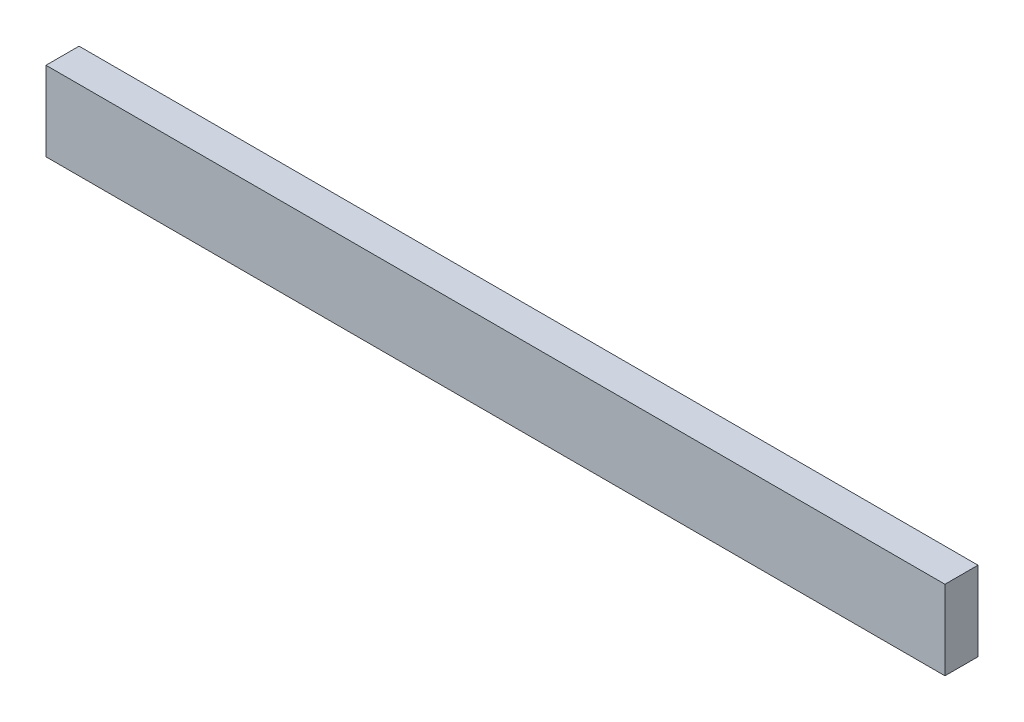
ISO-10303-21;
HEADER;
FILE_DESCRIPTION(('STEP AP214'),'2;1');
FILE_NAME('part.step','',(''),(''),'','','');
FILE_SCHEMA(('AUTOMOTIVE_DESIGN { 1 0 10303 214 1 1 1 1 }'));
ENDSEC;
DATA;
#1=APPLICATION_CONTEXT('core data for automotive mechanical design processes');
#2=APPLICATION_PROTOCOL_DEFINITION('international standard','automotive_design',2000,#1);
#3=PRODUCT_CONTEXT('',#1,'mechanical');
#4=PRODUCT('Part','Part','',(#3));
#5=PRODUCT_RELATED_PRODUCT_CATEGORY('part','',(#4));
#6=PRODUCT_DEFINITION_FORMATION('','',#4);
#7=PRODUCT_DEFINITION_CONTEXT('part definition',#1,'design');
#8=PRODUCT_DEFINITION('design','',#6,#7);
#9=PRODUCT_DEFINITION_SHAPE('','',#8);
#10=(LENGTH_UNIT() NAMED_UNIT(*) SI_UNIT(.MILLI.,.METRE.));
#11=(NAMED_UNIT(*) PLANE_ANGLE_UNIT() SI_UNIT($,.RADIAN.));
#12=(NAMED_UNIT(*) SI_UNIT($,.STERADIAN.) SOLID_ANGLE_UNIT());
#13=UNCERTAINTY_MEASURE_WITH_UNIT(LENGTH_MEASURE(1.E-05),#10,'distance_accuracy_value','');
#14=(GEOMETRIC_REPRESENTATION_CONTEXT(3) GLOBAL_UNCERTAINTY_ASSIGNED_CONTEXT((#13)) GLOBAL_UNIT_ASSIGNED_CONTEXT((#10,
#11,#12)) REPRESENTATION_CONTEXT('',''));
#15=CARTESIAN_POINT('',(0.,0.,0.));
#16=DIRECTION('',(0.,0.,1.));
#17=DIRECTION('',(1.,0.,0.));
#18=AXIS2_PLACEMENT_3D('',#15,#16,#17);
#19=CARTESIAN_POINT('',(0.,0.,25.));
#20=DIRECTION('',(1.,0.,0.));
#21=DIRECTION('',(0.,0.,-1.));
#22=AXIS2_PLACEMENT_3D('',#19,#20,#21);
#23=PLANE('',#22);
#24=DIRECTION('',(0.,-1.,0.));
#25=VECTOR('',#24,1.);
#26=CARTESIAN_POINT('',(0.,0.,0.));
#27=LINE('',#26,#25);
#28=CARTESIAN_POINT('',(0.,60.,0.));
#29=VERTEX_POINT('',#28);
#30=CARTESIAN_POINT('',(0.,0.,0.));
#31=VERTEX_POINT('',#30);
#32=EDGE_CURVE('E96',#29,#31,#27,.T.);
#33=ORIENTED_EDGE('',*,*,#32,.T.);
#34=DIRECTION('',(0.,0.,-1.));
#35=VECTOR('',#34,1.);
#36=CARTESIAN_POINT('',(0.,0.,25.));
#37=LINE('',#36,#35);
#38=CARTESIAN_POINT('',(0.,0.,25.));
#39=VERTEX_POINT('',#38);
#40=EDGE_CURVE('E11',#39,#31,#37,.T.);
#41=ORIENTED_EDGE('',*,*,#40,.F.);
#42=DIRECTION('',(0.,-1.,0.));
#43=VECTOR('',#42,1.);
#44=CARTESIAN_POINT('',(0.,0.,25.));
#45=LINE('',#44,#43);
#46=CARTESIAN_POINT('',(0.,60.,25.));
#47=VERTEX_POINT('',#46);
#48=EDGE_CURVE('E84',#47,#39,#45,.T.);
#49=ORIENTED_EDGE('',*,*,#48,.F.);
#50=DIRECTION('',(0.,0.,-1.));
#51=VECTOR('',#50,1.);
#52=CARTESIAN_POINT('',(0.,60.,25.));
#53=LINE('',#52,#51);
#54=EDGE_CURVE('E92',#47,#29,#53,.T.);
#55=ORIENTED_EDGE('',*,*,#54,.T.);
#56=EDGE_LOOP('',(#33,#41,#49,#55));
#57=FACE_BOUND('',#56,.T.);
#58=ADVANCED_FACE('F33',(#57),#23,.F.);
#59=CARTESIAN_POINT('',(0.,0.,25.));
#60=DIRECTION('',(0.,1.,0.));
#61=DIRECTION('',(0.,0.,1.));
#62=AXIS2_PLACEMENT_3D('',#59,#60,#61);
#63=PLANE('',#62);
#64=DIRECTION('',(1.,0.,0.));
#65=VECTOR('',#64,1.);
#66=CARTESIAN_POINT('',(0.,0.,0.));
#67=LINE('',#66,#65);
#68=CARTESIAN_POINT('',(680.,0.,0.));
#69=VERTEX_POINT('',#68);
#70=EDGE_CURVE('E88',#31,#69,#67,.T.);
#71=ORIENTED_EDGE('',*,*,#70,.T.);
#72=DIRECTION('',(0.,0.,-1.));
#73=VECTOR('',#72,1.);
#74=CARTESIAN_POINT('',(680.,0.,25.));
#75=LINE('',#74,#73);
#76=CARTESIAN_POINT('',(680.,0.,25.));
#77=VERTEX_POINT('',#76);
#78=EDGE_CURVE('E41',#77,#69,#75,.T.);
#79=ORIENTED_EDGE('',*,*,#78,.F.);
#80=DIRECTION('',(1.,0.,0.));
#81=VECTOR('',#80,1.);
#82=CARTESIAN_POINT('',(0.,0.,25.));
#83=LINE('',#82,#81);
#84=EDGE_CURVE('E79',#39,#77,#83,.T.);
#85=ORIENTED_EDGE('',*,*,#84,.F.);
#86=ORIENTED_EDGE('',*,*,#40,.T.);
#87=EDGE_LOOP('',(#71,#79,#85,#86));
#88=FACE_BOUND('',#87,.T.);
#89=ADVANCED_FACE('F87',(#88),#63,.F.);
#90=CARTESIAN_POINT('',(680.,0.,25.));
#91=DIRECTION('',(-1.,0.,0.));
#92=DIRECTION('',(0.,0.,1.));
#93=AXIS2_PLACEMENT_3D('',#90,#91,#92);
#94=PLANE('',#93);
#95=DIRECTION('',(0.,1.,0.));
#96=VECTOR('',#95,1.);
#97=CARTESIAN_POINT('',(680.,0.,0.));
#98=LINE('',#97,#96);
#99=CARTESIAN_POINT('',(680.,60.,0.));
#100=VERTEX_POINT('',#99);
#101=EDGE_CURVE('E66',#69,#100,#98,.T.);
#102=ORIENTED_EDGE('',*,*,#101,.T.);
#103=DIRECTION('',(0.,0.,-1.));
#104=VECTOR('',#103,1.);
#105=CARTESIAN_POINT('',(680.,60.,25.));
#106=LINE('',#105,#104);
#107=CARTESIAN_POINT('',(680.,60.,25.));
#108=VERTEX_POINT('',#107);
#109=EDGE_CURVE('E89',#108,#100,#106,.T.);
#110=ORIENTED_EDGE('',*,*,#109,.F.);
#111=DIRECTION('',(0.,1.,0.));
#112=VECTOR('',#111,1.);
#113=CARTESIAN_POINT('',(680.,0.,25.));
#114=LINE('',#113,#112);
#115=EDGE_CURVE('E82',#77,#108,#114,.T.);
#116=ORIENTED_EDGE('',*,*,#115,.F.);
#117=ORIENTED_EDGE('',*,*,#78,.T.);
#118=EDGE_LOOP('',(#102,#110,#116,#117));
#119=FACE_BOUND('',#118,.T.);
#120=ADVANCED_FACE('F90',(#119),#94,.F.);
#121=CARTESIAN_POINT('',(0.,60.,25.));
#122=DIRECTION('',(0.,-1.,0.));
#123=DIRECTION('',(0.,0.,-1.));
#124=AXIS2_PLACEMENT_3D('',#121,#122,#123);
#125=PLANE('',#124);
#126=DIRECTION('',(-1.,0.,0.));
#127=VECTOR('',#126,1.);
#128=CARTESIAN_POINT('',(0.,60.,0.));
#129=LINE('',#128,#127);
#130=EDGE_CURVE('E72',#100,#29,#129,.T.);
#131=ORIENTED_EDGE('',*,*,#130,.T.);
#132=ORIENTED_EDGE('',*,*,#54,.F.);
#133=DIRECTION('',(-1.,0.,0.));
#134=VECTOR('',#133,1.);
#135=CARTESIAN_POINT('',(0.,60.,25.));
#136=LINE('',#135,#134);
#137=EDGE_CURVE('E49',#108,#47,#136,.T.);
#138=ORIENTED_EDGE('',*,*,#137,.F.);
#139=ORIENTED_EDGE('',*,*,#109,.T.);
#140=EDGE_LOOP('',(#131,#132,#138,#139));
#141=FACE_BOUND('',#140,.T.);
#142=ADVANCED_FACE('F103',(#141),#125,.F.);
#143=CARTESIAN_POINT('',(0.,0.,25.));
#144=DIRECTION('',(0.,0.,-1.));
#145=DIRECTION('',(-1.,0.,0.));
#146=AXIS2_PLACEMENT_3D('',#143,#144,#145);
#147=PLANE('',#146);
#148=ORIENTED_EDGE('',*,*,#48,.T.);
#149=ORIENTED_EDGE('',*,*,#84,.T.);
#150=ORIENTED_EDGE('',*,*,#115,.T.);
#151=ORIENTED_EDGE('',*,*,#137,.T.);
#152=EDGE_LOOP('',(#148,#149,#150,#151));
#153=FACE_BOUND('',#152,.T.);
#154=ADVANCED_FACE('F80',(#153),#147,.F.);
#155=CARTESIAN_POINT('',(0.,0.,0.));
#156=DIRECTION('',(0.,0.,-1.));
#157=DIRECTION('',(-1.,0.,0.));
#158=AXIS2_PLACEMENT_3D('',#155,#156,#157);
#159=PLANE('',#158);
#160=ORIENTED_EDGE('',*,*,#32,.F.);
#161=ORIENTED_EDGE('',*,*,#130,.F.);
#162=ORIENTED_EDGE('',*,*,#101,.F.);
#163=ORIENTED_EDGE('',*,*,#70,.F.);
#164=EDGE_LOOP('',(#160,#161,#162,#163));
#165=FACE_BOUND('',#164,.T.);
#166=ADVANCED_FACE('F106',(#165),#159,.T.);
#167=CLOSED_SHELL('',(#58,#89,#120,#142,#154,#166));
#168=MANIFOLD_SOLID_BREP('B2',#167);
#169=ADVANCED_BREP_SHAPE_REPRESENTATION('',(#18,#168),#14);
#170=SHAPE_DEFINITION_REPRESENTATION(#9,#169);
ENDSEC;
END-ISO-10303-21;
